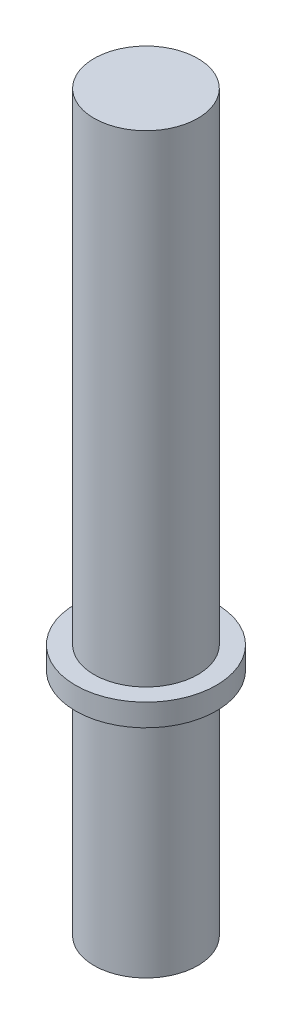
ISO-10303-21;
HEADER;
FILE_DESCRIPTION(('STEP AP214'),'2;1');
FILE_NAME('part.step','',(''),(''),'','','');
FILE_SCHEMA(('AUTOMOTIVE_DESIGN { 1 0 10303 214 1 1 1 1 }'));
ENDSEC;
DATA;
#1=APPLICATION_CONTEXT('core data for automotive mechanical design processes');
#2=APPLICATION_PROTOCOL_DEFINITION('international standard','automotive_design',2000,#1);
#3=PRODUCT_CONTEXT('',#1,'mechanical');
#4=PRODUCT('Part','Part','',(#3));
#5=PRODUCT_RELATED_PRODUCT_CATEGORY('part','',(#4));
#6=PRODUCT_DEFINITION_FORMATION('','',#4);
#7=PRODUCT_DEFINITION_CONTEXT('part definition',#1,'design');
#8=PRODUCT_DEFINITION('design','',#6,#7);
#9=PRODUCT_DEFINITION_SHAPE('','',#8);
#10=(LENGTH_UNIT() NAMED_UNIT(*) SI_UNIT(.MILLI.,.METRE.));
#11=(NAMED_UNIT(*) PLANE_ANGLE_UNIT() SI_UNIT($,.RADIAN.));
#12=(NAMED_UNIT(*) SI_UNIT($,.STERADIAN.) SOLID_ANGLE_UNIT());
#13=UNCERTAINTY_MEASURE_WITH_UNIT(LENGTH_MEASURE(1.E-05),#10,'distance_accuracy_value','');
#14=(GEOMETRIC_REPRESENTATION_CONTEXT(3) GLOBAL_UNCERTAINTY_ASSIGNED_CONTEXT((#13)) GLOBAL_UNIT_ASSIGNED_CONTEXT((#10,
#11,#12)) REPRESENTATION_CONTEXT('',''));
#15=CARTESIAN_POINT('',(0.,0.,0.));
#16=DIRECTION('',(0.,0.,1.));
#17=DIRECTION('',(1.,0.,0.));
#18=AXIS2_PLACEMENT_3D('',#15,#16,#17);
#19=CARTESIAN_POINT('',(0.,-34.,0.));
#20=DIRECTION('',(0.,1.,0.));
#21=DIRECTION('',(0.,0.,1.));
#22=AXIS2_PLACEMENT_3D('',#19,#20,#21);
#23=CYLINDRICAL_SURFACE('',#22,7.);
#24=CARTESIAN_POINT('',(0.,-34.,0.));
#25=DIRECTION('',(0.,1.,0.));
#26=DIRECTION('',(0.,0.,1.));
#27=AXIS2_PLACEMENT_3D('',#24,#25,#26);
#28=CIRCLE('',#27,7.);
#29=CARTESIAN_POINT('',(0.,-34.,7.));
#30=VERTEX_POINT('',#29);
#31=EDGE_CURVE('E39',#30,#30,#28,.T.);
#32=ORIENTED_EDGE('',*,*,#31,.T.);
#33=EDGE_LOOP('',(#32));
#34=FACE_BOUND('',#33,.T.);
#35=CARTESIAN_POINT('',(0.,-3.,0.));
#36=DIRECTION('',(0.,1.,0.));
#37=DIRECTION('',(0.,0.,1.));
#38=AXIS2_PLACEMENT_3D('',#35,#36,#37);
#39=CIRCLE('',#38,7.);
#40=CARTESIAN_POINT('',(0.,-3.,7.));
#41=VERTEX_POINT('',#40);
#42=EDGE_CURVE('E35',#41,#41,#39,.F.);
#43=ORIENTED_EDGE('',*,*,#42,.T.);
#44=EDGE_LOOP('',(#43));
#45=FACE_BOUND('',#44,.T.);
#46=ADVANCED_FACE('F31',(#34,#45),#23,.T.);
#47=CARTESIAN_POINT('',(0.,-34.,0.));
#48=DIRECTION('',(0.,1.,0.));
#49=DIRECTION('',(0.,0.,1.));
#50=AXIS2_PLACEMENT_3D('',#47,#48,#49);
#51=PLANE('',#50);
#52=ORIENTED_EDGE('',*,*,#31,.F.);
#53=EDGE_LOOP('',(#52));
#54=FACE_BOUND('',#53,.T.);
#55=ADVANCED_FACE('F71',(#54),#51,.F.);
#56=CARTESIAN_POINT('',(0.,-3.,0.));
#57=DIRECTION('',(0.,1.,0.));
#58=DIRECTION('',(0.,0.,1.));
#59=AXIS2_PLACEMENT_3D('',#56,#57,#58);
#60=CYLINDRICAL_SURFACE('',#59,9.5);
#61=CARTESIAN_POINT('',(0.,-3.,0.));
#62=DIRECTION('',(0.,1.,0.));
#63=DIRECTION('',(0.,0.,1.));
#64=AXIS2_PLACEMENT_3D('',#61,#62,#63);
#65=CIRCLE('',#64,9.5);
#66=CARTESIAN_POINT('',(0.,-3.,9.5));
#67=VERTEX_POINT('',#66);
#68=EDGE_CURVE('E51',#67,#67,#65,.T.);
#69=ORIENTED_EDGE('',*,*,#68,.T.);
#70=EDGE_LOOP('',(#69));
#71=FACE_BOUND('',#70,.T.);
#72=CARTESIAN_POINT('',(0.,0.,0.));
#73=DIRECTION('',(0.,1.,0.));
#74=DIRECTION('',(0.,0.,1.));
#75=AXIS2_PLACEMENT_3D('',#72,#73,#74);
#76=CIRCLE('',#75,9.5);
#77=CARTESIAN_POINT('',(0.,0.,9.5));
#78=VERTEX_POINT('',#77);
#79=EDGE_CURVE('E48',#78,#78,#76,.T.);
#80=ORIENTED_EDGE('',*,*,#79,.F.);
#81=EDGE_LOOP('',(#80));
#82=FACE_BOUND('',#81,.T.);
#83=ADVANCED_FACE('F63',(#71,#82),#60,.T.);
#84=CARTESIAN_POINT('',(0.,-3.,0.));
#85=DIRECTION('',(0.,1.,0.));
#86=DIRECTION('',(0.,0.,1.));
#87=AXIS2_PLACEMENT_3D('',#84,#85,#86);
#88=PLANE('',#87);
#89=ORIENTED_EDGE('',*,*,#42,.F.);
#90=EDGE_LOOP('',(#89));
#91=FACE_BOUND('',#90,.T.);
#92=ORIENTED_EDGE('',*,*,#68,.F.);
#93=EDGE_LOOP('',(#92));
#94=FACE_BOUND('',#93,.T.);
#95=ADVANCED_FACE('F59',(#91,#94),#88,.F.);
#96=CARTESIAN_POINT('',(0.,0.,0.));
#97=DIRECTION('',(0.,1.,0.));
#98=DIRECTION('',(0.,0.,1.));
#99=AXIS2_PLACEMENT_3D('',#96,#97,#98);
#100=PLANE('',#99);
#101=CARTESIAN_POINT('',(0.,0.,0.));
#102=DIRECTION('',(0.,1.,0.));
#103=DIRECTION('',(0.,0.,1.));
#104=AXIS2_PLACEMENT_3D('',#101,#102,#103);
#105=CIRCLE('',#104,7.);
#106=CARTESIAN_POINT('',(0.,0.,7.));
#107=VERTEX_POINT('',#106);
#108=EDGE_CURVE('E10',#107,#107,#105,.F.);
#109=ORIENTED_EDGE('',*,*,#108,.T.);
#110=EDGE_LOOP('',(#109));
#111=FACE_BOUND('',#110,.T.);
#112=ORIENTED_EDGE('',*,*,#79,.T.);
#113=EDGE_LOOP('',(#112));
#114=FACE_BOUND('',#113,.T.);
#115=ADVANCED_FACE('F62',(#111,#114),#100,.T.);
#116=CARTESIAN_POINT('',(0.,65.,0.));
#117=DIRECTION('',(0.,1.,0.));
#118=DIRECTION('',(0.,0.,1.));
#119=AXIS2_PLACEMENT_3D('',#116,#117,#118);
#120=PLANE('',#119);
#121=CARTESIAN_POINT('',(0.,65.,0.));
#122=DIRECTION('',(0.,1.,0.));
#123=DIRECTION('',(0.,0.,1.));
#124=AXIS2_PLACEMENT_3D('',#121,#122,#123);
#125=CIRCLE('',#124,7.);
#126=CARTESIAN_POINT('',(0.,65.,7.));
#127=VERTEX_POINT('',#126);
#128=EDGE_CURVE('E43',#127,#127,#125,.T.);
#129=ORIENTED_EDGE('',*,*,#128,.T.);
#130=EDGE_LOOP('',(#129));
#131=FACE_BOUND('',#130,.T.);
#132=ADVANCED_FACE('F69',(#131),#120,.T.);
#133=ORIENTED_EDGE('',*,*,#108,.F.);
#134=EDGE_LOOP('',(#133));
#135=FACE_BOUND('',#134,.T.);
#136=ORIENTED_EDGE('',*,*,#128,.F.);
#137=EDGE_LOOP('',(#136));
#138=FACE_BOUND('',#137,.T.);
#139=ADVANCED_FACE('F33',(#135,#138),#23,.T.);
#140=CLOSED_SHELL('',(#46,#55,#83,#95,#115,#132,#139));
#141=MANIFOLD_SOLID_BREP('B2',#140);
#142=ADVANCED_BREP_SHAPE_REPRESENTATION('',(#18,#141),#14);
#143=SHAPE_DEFINITION_REPRESENTATION(#9,#142);
ENDSEC;
END-ISO-10303-21;
